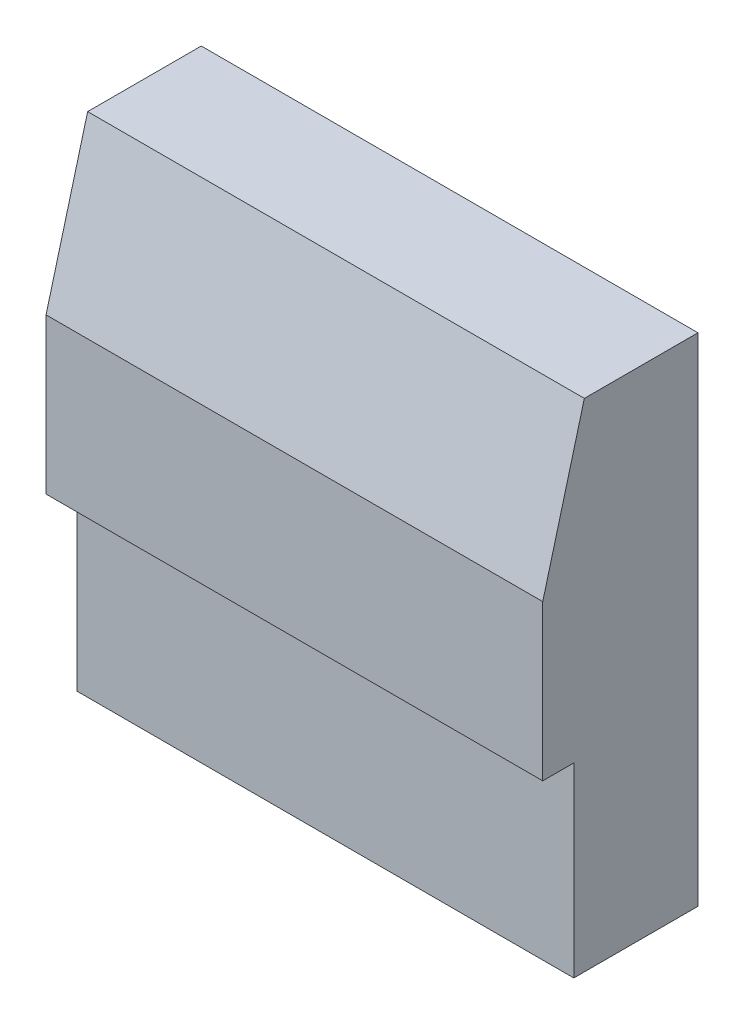
ISO-10303-21;
HEADER;
FILE_DESCRIPTION(('STEP AP214'),'2;1');
FILE_NAME('part.step','',(''),(''),'','','');
FILE_SCHEMA(('AUTOMOTIVE_DESIGN { 1 0 10303 214 1 1 1 1 }'));
ENDSEC;
DATA;
#1=APPLICATION_CONTEXT('core data for automotive mechanical design processes');
#2=APPLICATION_PROTOCOL_DEFINITION('international standard','automotive_design',2000,#1);
#3=PRODUCT_CONTEXT('',#1,'mechanical');
#4=PRODUCT('Part','Part','',(#3));
#5=PRODUCT_RELATED_PRODUCT_CATEGORY('part','',(#4));
#6=PRODUCT_DEFINITION_FORMATION('','',#4);
#7=PRODUCT_DEFINITION_CONTEXT('part definition',#1,'design');
#8=PRODUCT_DEFINITION('design','',#6,#7);
#9=PRODUCT_DEFINITION_SHAPE('','',#8);
#10=(LENGTH_UNIT() NAMED_UNIT(*) SI_UNIT(.MILLI.,.METRE.));
#11=(NAMED_UNIT(*) PLANE_ANGLE_UNIT() SI_UNIT($,.RADIAN.));
#12=(NAMED_UNIT(*) SI_UNIT($,.STERADIAN.) SOLID_ANGLE_UNIT());
#13=UNCERTAINTY_MEASURE_WITH_UNIT(LENGTH_MEASURE(1.E-05),#10,'distance_accuracy_value','');
#14=(GEOMETRIC_REPRESENTATION_CONTEXT(3) GLOBAL_UNCERTAINTY_ASSIGNED_CONTEXT((#13)) GLOBAL_UNIT_ASSIGNED_CONTEXT((#10,
#11,#12)) REPRESENTATION_CONTEXT('',''));
#15=CARTESIAN_POINT('',(0.,0.,0.));
#16=DIRECTION('',(0.,0.,1.));
#17=DIRECTION('',(1.,0.,0.));
#18=AXIS2_PLACEMENT_3D('',#15,#16,#17);
#19=CARTESIAN_POINT('',(-16.,0.,8.));
#20=DIRECTION('',(0.,-1.,0.));
#21=DIRECTION('',(0.,0.,-1.));
#22=AXIS2_PLACEMENT_3D('',#19,#20,#21);
#23=PLANE('',#22);
#24=DIRECTION('',(1.,0.,0.));
#25=VECTOR('',#24,1.);
#26=CARTESIAN_POINT('',(-16.,0.,0.));
#27=LINE('',#26,#25);
#28=CARTESIAN_POINT('',(-16.,0.,0.));
#29=VERTEX_POINT('',#28);
#30=CARTESIAN_POINT('',(16.,0.,0.));
#31=VERTEX_POINT('',#30);
#32=EDGE_CURVE('E35',#29,#31,#27,.T.);
#33=ORIENTED_EDGE('',*,*,#32,.T.);
#34=DIRECTION('',(0.,0.,-1.));
#35=VECTOR('',#34,1.);
#36=CARTESIAN_POINT('',(16.,0.,8.));
#37=LINE('',#36,#35);
#38=CARTESIAN_POINT('',(16.,0.,8.));
#39=VERTEX_POINT('',#38);
#40=EDGE_CURVE('E90',#39,#31,#37,.T.);
#41=ORIENTED_EDGE('',*,*,#40,.F.);
#42=DIRECTION('',(1.,0.,0.));
#43=VECTOR('',#42,1.);
#44=CARTESIAN_POINT('',(-16.,0.,8.));
#45=LINE('',#44,#43);
#46=CARTESIAN_POINT('',(-16.,0.,8.));
#47=VERTEX_POINT('',#46);
#48=EDGE_CURVE('E11',#47,#39,#45,.T.);
#49=ORIENTED_EDGE('',*,*,#48,.F.);
#50=DIRECTION('',(0.,0.,-1.));
#51=VECTOR('',#50,1.);
#52=CARTESIAN_POINT('',(-16.,0.,8.));
#53=LINE('',#52,#51);
#54=EDGE_CURVE('E91',#47,#29,#53,.T.);
#55=ORIENTED_EDGE('',*,*,#54,.T.);
#56=EDGE_LOOP('',(#33,#41,#49,#55));
#57=FACE_BOUND('',#56,.T.);
#58=ADVANCED_FACE('F32',(#57),#23,.T.);
#59=CARTESIAN_POINT('',(-16.,12.,8.));
#60=DIRECTION('',(0.,0.,1.));
#61=DIRECTION('',(0.,-1.,0.));
#62=AXIS2_PLACEMENT_3D('',#59,#60,#61);
#63=PLANE('',#62);
#64=ORIENTED_EDGE('',*,*,#48,.T.);
#65=DIRECTION('',(0.,-1.,0.));
#66=VECTOR('',#65,1.);
#67=CARTESIAN_POINT('',(16.,12.,8.));
#68=LINE('',#67,#66);
#69=CARTESIAN_POINT('',(16.,12.,8.));
#70=VERTEX_POINT('',#69);
#71=EDGE_CURVE('E108',#70,#39,#68,.T.);
#72=ORIENTED_EDGE('',*,*,#71,.F.);
#73=DIRECTION('',(1.,0.,0.));
#74=VECTOR('',#73,1.);
#75=CARTESIAN_POINT('',(-16.,12.,8.));
#76=LINE('',#75,#74);
#77=CARTESIAN_POINT('',(-16.,12.,8.));
#78=VERTEX_POINT('',#77);
#79=EDGE_CURVE('E40',#78,#70,#76,.T.);
#80=ORIENTED_EDGE('',*,*,#79,.F.);
#81=DIRECTION('',(0.,-1.,0.));
#82=VECTOR('',#81,1.);
#83=CARTESIAN_POINT('',(-16.,12.,8.));
#84=LINE('',#83,#82);
#85=EDGE_CURVE('E96',#78,#47,#84,.T.);
#86=ORIENTED_EDGE('',*,*,#85,.T.);
#87=EDGE_LOOP('',(#64,#72,#80,#86));
#88=FACE_BOUND('',#87,.T.);
#89=ADVANCED_FACE('F160',(#88),#63,.T.);
#90=CARTESIAN_POINT('',(-16.,12.,10.));
#91=DIRECTION('',(0.,-1.,0.));
#92=DIRECTION('',(0.,0.,-1.));
#93=AXIS2_PLACEMENT_3D('',#90,#91,#92);
#94=PLANE('',#93);
#95=ORIENTED_EDGE('',*,*,#79,.T.);
#96=DIRECTION('',(0.,0.,-1.));
#97=VECTOR('',#96,1.);
#98=CARTESIAN_POINT('',(16.,12.,10.));
#99=LINE('',#98,#97);
#100=CARTESIAN_POINT('',(16.,12.,10.));
#101=VERTEX_POINT('',#100);
#102=EDGE_CURVE('E118',#101,#70,#99,.T.);
#103=ORIENTED_EDGE('',*,*,#102,.F.);
#104=DIRECTION('',(1.,0.,0.));
#105=VECTOR('',#104,1.);
#106=CARTESIAN_POINT('',(-16.,12.,10.));
#107=LINE('',#106,#105);
#108=CARTESIAN_POINT('',(-16.,12.,10.));
#109=VERTEX_POINT('',#108);
#110=EDGE_CURVE('E137',#109,#101,#107,.T.);
#111=ORIENTED_EDGE('',*,*,#110,.F.);
#112=DIRECTION('',(0.,0.,-1.));
#113=VECTOR('',#112,1.);
#114=CARTESIAN_POINT('',(-16.,12.,10.));
#115=LINE('',#114,#113);
#116=EDGE_CURVE('E133',#109,#78,#115,.T.);
#117=ORIENTED_EDGE('',*,*,#116,.T.);
#118=EDGE_LOOP('',(#95,#103,#111,#117));
#119=FACE_BOUND('',#118,.T.);
#120=ADVANCED_FACE('F158',(#119),#94,.T.);
#121=CARTESIAN_POINT('',(-16.,22.,10.));
#122=DIRECTION('',(0.,0.,1.));
#123=DIRECTION('',(0.,-1.,0.));
#124=AXIS2_PLACEMENT_3D('',#121,#122,#123);
#125=PLANE('',#124);
#126=ORIENTED_EDGE('',*,*,#110,.T.);
#127=DIRECTION('',(0.,-1.,0.));
#128=VECTOR('',#127,1.);
#129=CARTESIAN_POINT('',(16.,22.,10.));
#130=LINE('',#129,#128);
#131=CARTESIAN_POINT('',(16.,22.,10.));
#132=VERTEX_POINT('',#131);
#133=EDGE_CURVE('E115',#132,#101,#130,.T.);
#134=ORIENTED_EDGE('',*,*,#133,.F.);
#135=DIRECTION('',(1.,0.,0.));
#136=VECTOR('',#135,1.);
#137=CARTESIAN_POINT('',(-16.,22.,10.));
#138=LINE('',#137,#136);
#139=CARTESIAN_POINT('',(-16.,22.,10.));
#140=VERTEX_POINT('',#139);
#141=EDGE_CURVE('E139',#140,#132,#138,.T.);
#142=ORIENTED_EDGE('',*,*,#141,.F.);
#143=DIRECTION('',(0.,-1.,0.));
#144=VECTOR('',#143,1.);
#145=CARTESIAN_POINT('',(-16.,22.,10.));
#146=LINE('',#145,#144);
#147=EDGE_CURVE('E130',#140,#109,#146,.T.);
#148=ORIENTED_EDGE('',*,*,#147,.T.);
#149=EDGE_LOOP('',(#126,#134,#142,#148));
#150=FACE_BOUND('',#149,.T.);
#151=ADVANCED_FACE('F152',(#150),#125,.T.);
#152=CARTESIAN_POINT('',(-16.,32.,7.32050807568877));
#153=DIRECTION('',(0.,0.258819045102522,0.965925826289068));
#154=DIRECTION('',(0.,-0.965925826289068,0.258819045102522));
#155=AXIS2_PLACEMENT_3D('',#152,#153,#154);
#156=PLANE('',#155);
#157=ORIENTED_EDGE('',*,*,#141,.T.);
#158=DIRECTION('',(0.,-0.965925826289068,0.258819045102522));
#159=VECTOR('',#158,1.);
#160=CARTESIAN_POINT('',(16.,32.,7.32050807568877));
#161=LINE('',#160,#159);
#162=CARTESIAN_POINT('',(16.,32.,7.32050807568877));
#163=VERTEX_POINT('',#162);
#164=EDGE_CURVE('E112',#163,#132,#161,.T.);
#165=ORIENTED_EDGE('',*,*,#164,.F.);
#166=DIRECTION('',(1.,0.,0.));
#167=VECTOR('',#166,1.);
#168=CARTESIAN_POINT('',(-16.,32.,7.32050807568877));
#169=LINE('',#168,#167);
#170=CARTESIAN_POINT('',(-16.,32.,7.32050807568877));
#171=VERTEX_POINT('',#170);
#172=EDGE_CURVE('E141',#171,#163,#169,.T.);
#173=ORIENTED_EDGE('',*,*,#172,.F.);
#174=DIRECTION('',(0.,-0.965925826289068,0.258819045102522));
#175=VECTOR('',#174,1.);
#176=CARTESIAN_POINT('',(-16.,32.,7.32050807568877));
#177=LINE('',#176,#175);
#178=EDGE_CURVE('E127',#171,#140,#177,.T.);
#179=ORIENTED_EDGE('',*,*,#178,.T.);
#180=EDGE_LOOP('',(#157,#165,#173,#179));
#181=FACE_BOUND('',#180,.T.);
#182=ADVANCED_FACE('F149',(#181),#156,.T.);
#183=CARTESIAN_POINT('',(-16.,32.,0.));
#184=DIRECTION('',(0.,1.,0.));
#185=DIRECTION('',(0.,0.,1.));
#186=AXIS2_PLACEMENT_3D('',#183,#184,#185);
#187=PLANE('',#186);
#188=ORIENTED_EDGE('',*,*,#172,.T.);
#189=DIRECTION('',(0.,0.,1.));
#190=VECTOR('',#189,1.);
#191=CARTESIAN_POINT('',(16.,32.,0.));
#192=LINE('',#191,#190);
#193=CARTESIAN_POINT('',(16.,32.,0.));
#194=VERTEX_POINT('',#193);
#195=EDGE_CURVE('E103',#194,#163,#192,.T.);
#196=ORIENTED_EDGE('',*,*,#195,.F.);
#197=DIRECTION('',(1.,0.,0.));
#198=VECTOR('',#197,1.);
#199=CARTESIAN_POINT('',(-16.,32.,0.));
#200=LINE('',#199,#198);
#201=CARTESIAN_POINT('',(-16.,32.,0.));
#202=VERTEX_POINT('',#201);
#203=EDGE_CURVE('E95',#202,#194,#200,.T.);
#204=ORIENTED_EDGE('',*,*,#203,.F.);
#205=DIRECTION('',(0.,0.,1.));
#206=VECTOR('',#205,1.);
#207=CARTESIAN_POINT('',(-16.,32.,0.));
#208=LINE('',#207,#206);
#209=EDGE_CURVE('E124',#202,#171,#208,.T.);
#210=ORIENTED_EDGE('',*,*,#209,.T.);
#211=EDGE_LOOP('',(#188,#196,#204,#210));
#212=FACE_BOUND('',#211,.T.);
#213=ADVANCED_FACE('F143',(#212),#187,.T.);
#214=CARTESIAN_POINT('',(-16.,0.,0.));
#215=DIRECTION('',(0.,0.,-1.));
#216=DIRECTION('',(-1.,0.,0.));
#217=AXIS2_PLACEMENT_3D('',#214,#215,#216);
#218=PLANE('',#217);
#219=ORIENTED_EDGE('',*,*,#203,.T.);
#220=DIRECTION('',(0.,1.,0.));
#221=VECTOR('',#220,1.);
#222=CARTESIAN_POINT('',(16.,0.,0.));
#223=LINE('',#222,#221);
#224=EDGE_CURVE('E98',#31,#194,#223,.T.);
#225=ORIENTED_EDGE('',*,*,#224,.F.);
#226=ORIENTED_EDGE('',*,*,#32,.F.);
#227=DIRECTION('',(0.,1.,0.));
#228=VECTOR('',#227,1.);
#229=CARTESIAN_POINT('',(-16.,0.,0.));
#230=LINE('',#229,#228);
#231=EDGE_CURVE('E122',#29,#202,#230,.T.);
#232=ORIENTED_EDGE('',*,*,#231,.T.);
#233=EDGE_LOOP('',(#219,#225,#226,#232));
#234=FACE_BOUND('',#233,.T.);
#235=ADVANCED_FACE('F99',(#234),#218,.T.);
#236=CARTESIAN_POINT('',(-16.,0.,0.));
#237=DIRECTION('',(1.,0.,0.));
#238=DIRECTION('',(0.,0.,-1.));
#239=AXIS2_PLACEMENT_3D('',#236,#237,#238);
#240=PLANE('',#239);
#241=ORIENTED_EDGE('',*,*,#54,.F.);
#242=ORIENTED_EDGE('',*,*,#85,.F.);
#243=ORIENTED_EDGE('',*,*,#116,.F.);
#244=ORIENTED_EDGE('',*,*,#147,.F.);
#245=ORIENTED_EDGE('',*,*,#178,.F.);
#246=ORIENTED_EDGE('',*,*,#209,.F.);
#247=ORIENTED_EDGE('',*,*,#231,.F.);
#248=EDGE_LOOP('',(#241,#242,#243,#244,#245,#246,#247));
#249=FACE_BOUND('',#248,.T.);
#250=ADVANCED_FACE('F155',(#249),#240,.F.);
#251=CARTESIAN_POINT('',(16.,0.,0.));
#252=DIRECTION('',(1.,0.,0.));
#253=DIRECTION('',(0.,0.,-1.));
#254=AXIS2_PLACEMENT_3D('',#251,#252,#253);
#255=PLANE('',#254);
#256=ORIENTED_EDGE('',*,*,#40,.T.);
#257=ORIENTED_EDGE('',*,*,#224,.T.);
#258=ORIENTED_EDGE('',*,*,#195,.T.);
#259=ORIENTED_EDGE('',*,*,#164,.T.);
#260=ORIENTED_EDGE('',*,*,#133,.T.);
#261=ORIENTED_EDGE('',*,*,#102,.T.);
#262=ORIENTED_EDGE('',*,*,#71,.T.);
#263=EDGE_LOOP('',(#256,#257,#258,#259,#260,#261,#262));
#264=FACE_BOUND('',#263,.T.);
#265=ADVANCED_FACE('F106',(#264),#255,.T.);
#266=CLOSED_SHELL('',(#58,#89,#120,#151,#182,#213,#235,#250,#265));
#267=MANIFOLD_SOLID_BREP('B2',#266);
#268=ADVANCED_BREP_SHAPE_REPRESENTATION('',(#18,#267),#14);
#269=SHAPE_DEFINITION_REPRESENTATION(#9,#268);
ENDSEC;
END-ISO-10303-21;
